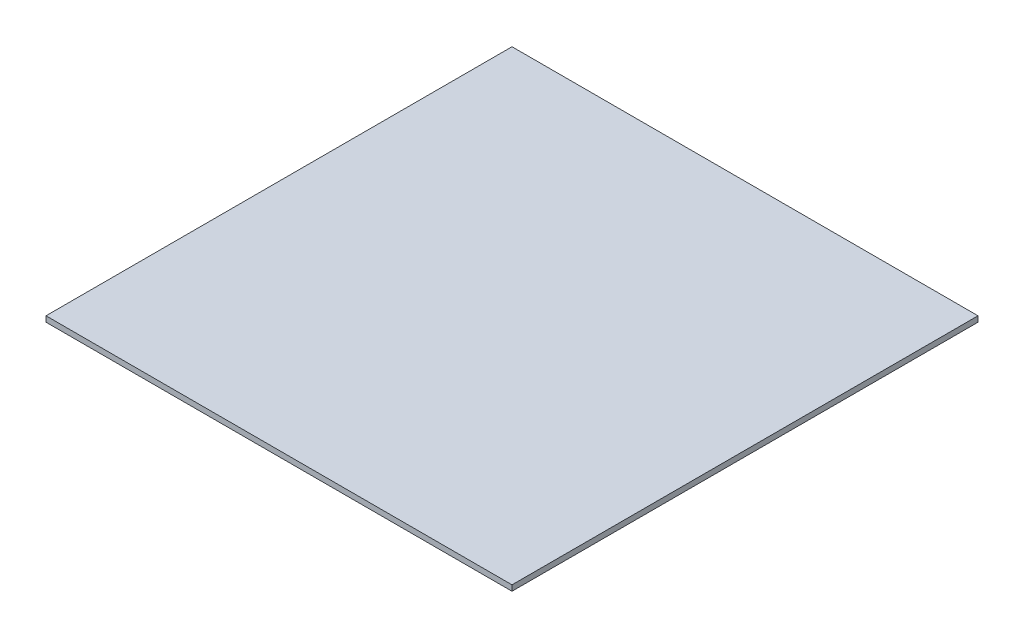
ISO-10303-21;
HEADER;
FILE_DESCRIPTION(('STEP AP214'),'2;1');
FILE_NAME('part.step','',(''),(''),'','','');
FILE_SCHEMA(('AUTOMOTIVE_DESIGN { 1 0 10303 214 1 1 1 1 }'));
ENDSEC;
DATA;
#1=APPLICATION_CONTEXT('core data for automotive mechanical design processes');
#2=APPLICATION_PROTOCOL_DEFINITION('international standard','automotive_design',2000,#1);
#3=PRODUCT_CONTEXT('',#1,'mechanical');
#4=PRODUCT('Part','Part','',(#3));
#5=PRODUCT_RELATED_PRODUCT_CATEGORY('part','',(#4));
#6=PRODUCT_DEFINITION_FORMATION('','',#4);
#7=PRODUCT_DEFINITION_CONTEXT('part definition',#1,'design');
#8=PRODUCT_DEFINITION('design','',#6,#7);
#9=PRODUCT_DEFINITION_SHAPE('','',#8);
#10=(LENGTH_UNIT() NAMED_UNIT(*) SI_UNIT(.MILLI.,.METRE.));
#11=(NAMED_UNIT(*) PLANE_ANGLE_UNIT() SI_UNIT($,.RADIAN.));
#12=(NAMED_UNIT(*) SI_UNIT($,.STERADIAN.) SOLID_ANGLE_UNIT());
#13=UNCERTAINTY_MEASURE_WITH_UNIT(LENGTH_MEASURE(1.E-05),#10,'distance_accuracy_value','');
#14=(GEOMETRIC_REPRESENTATION_CONTEXT(3) GLOBAL_UNCERTAINTY_ASSIGNED_CONTEXT((#13)) GLOBAL_UNIT_ASSIGNED_CONTEXT((#10,
#11,#12)) REPRESENTATION_CONTEXT('',''));
#15=CARTESIAN_POINT('',(0.,0.,0.));
#16=DIRECTION('',(0.,0.,1.));
#17=DIRECTION('',(1.,0.,0.));
#18=AXIS2_PLACEMENT_3D('',#15,#16,#17);
#19=CARTESIAN_POINT('',(-125.,3.,-125.));
#20=DIRECTION('',(1.,0.,0.));
#21=DIRECTION('',(0.,0.,-1.));
#22=AXIS2_PLACEMENT_3D('',#19,#20,#21);
#23=PLANE('',#22);
#24=DIRECTION('',(0.,0.,1.));
#25=VECTOR('',#24,1.);
#26=CARTESIAN_POINT('',(-125.,0.,-125.));
#27=LINE('',#26,#25);
#28=CARTESIAN_POINT('',(-125.,0.,-125.));
#29=VERTEX_POINT('',#28);
#30=CARTESIAN_POINT('',(-125.,0.,125.));
#31=VERTEX_POINT('',#30);
#32=EDGE_CURVE('E96',#29,#31,#27,.T.);
#33=ORIENTED_EDGE('',*,*,#32,.T.);
#34=DIRECTION('',(0.,-1.,0.));
#35=VECTOR('',#34,1.);
#36=CARTESIAN_POINT('',(-125.,3.,125.));
#37=LINE('',#36,#35);
#38=CARTESIAN_POINT('',(-125.,3.,125.));
#39=VERTEX_POINT('',#38);
#40=EDGE_CURVE('E11',#39,#31,#37,.T.);
#41=ORIENTED_EDGE('',*,*,#40,.F.);
#42=DIRECTION('',(0.,0.,1.));
#43=VECTOR('',#42,1.);
#44=CARTESIAN_POINT('',(-125.,3.,-125.));
#45=LINE('',#44,#43);
#46=CARTESIAN_POINT('',(-125.,3.,-125.));
#47=VERTEX_POINT('',#46);
#48=EDGE_CURVE('E84',#47,#39,#45,.T.);
#49=ORIENTED_EDGE('',*,*,#48,.F.);
#50=DIRECTION('',(0.,-1.,0.));
#51=VECTOR('',#50,1.);
#52=CARTESIAN_POINT('',(-125.,3.,-125.));
#53=LINE('',#52,#51);
#54=EDGE_CURVE('E92',#47,#29,#53,.T.);
#55=ORIENTED_EDGE('',*,*,#54,.T.);
#56=EDGE_LOOP('',(#33,#41,#49,#55));
#57=FACE_BOUND('',#56,.T.);
#58=ADVANCED_FACE('F33',(#57),#23,.F.);
#59=CARTESIAN_POINT('',(-125.,3.,125.));
#60=DIRECTION('',(0.,0.,-1.));
#61=DIRECTION('',(-1.,0.,0.));
#62=AXIS2_PLACEMENT_3D('',#59,#60,#61);
#63=PLANE('',#62);
#64=DIRECTION('',(1.,0.,0.));
#65=VECTOR('',#64,1.);
#66=CARTESIAN_POINT('',(-125.,0.,125.));
#67=LINE('',#66,#65);
#68=CARTESIAN_POINT('',(125.,0.,125.));
#69=VERTEX_POINT('',#68);
#70=EDGE_CURVE('E88',#31,#69,#67,.T.);
#71=ORIENTED_EDGE('',*,*,#70,.T.);
#72=DIRECTION('',(0.,-1.,0.));
#73=VECTOR('',#72,1.);
#74=CARTESIAN_POINT('',(125.,3.,125.));
#75=LINE('',#74,#73);
#76=CARTESIAN_POINT('',(125.,3.,125.));
#77=VERTEX_POINT('',#76);
#78=EDGE_CURVE('E41',#77,#69,#75,.T.);
#79=ORIENTED_EDGE('',*,*,#78,.F.);
#80=DIRECTION('',(1.,0.,0.));
#81=VECTOR('',#80,1.);
#82=CARTESIAN_POINT('',(-125.,3.,125.));
#83=LINE('',#82,#81);
#84=EDGE_CURVE('E79',#39,#77,#83,.T.);
#85=ORIENTED_EDGE('',*,*,#84,.F.);
#86=ORIENTED_EDGE('',*,*,#40,.T.);
#87=EDGE_LOOP('',(#71,#79,#85,#86));
#88=FACE_BOUND('',#87,.T.);
#89=ADVANCED_FACE('F87',(#88),#63,.F.);
#90=CARTESIAN_POINT('',(125.,3.,-125.));
#91=DIRECTION('',(-1.,0.,0.));
#92=DIRECTION('',(0.,0.,1.));
#93=AXIS2_PLACEMENT_3D('',#90,#91,#92);
#94=PLANE('',#93);
#95=DIRECTION('',(0.,0.,-1.));
#96=VECTOR('',#95,1.);
#97=CARTESIAN_POINT('',(125.,0.,-125.));
#98=LINE('',#97,#96);
#99=CARTESIAN_POINT('',(125.,0.,-125.));
#100=VERTEX_POINT('',#99);
#101=EDGE_CURVE('E66',#69,#100,#98,.T.);
#102=ORIENTED_EDGE('',*,*,#101,.T.);
#103=DIRECTION('',(0.,-1.,0.));
#104=VECTOR('',#103,1.);
#105=CARTESIAN_POINT('',(125.,3.,-125.));
#106=LINE('',#105,#104);
#107=CARTESIAN_POINT('',(125.,3.,-125.));
#108=VERTEX_POINT('',#107);
#109=EDGE_CURVE('E89',#108,#100,#106,.T.);
#110=ORIENTED_EDGE('',*,*,#109,.F.);
#111=DIRECTION('',(0.,0.,-1.));
#112=VECTOR('',#111,1.);
#113=CARTESIAN_POINT('',(125.,3.,-125.));
#114=LINE('',#113,#112);
#115=EDGE_CURVE('E82',#77,#108,#114,.T.);
#116=ORIENTED_EDGE('',*,*,#115,.F.);
#117=ORIENTED_EDGE('',*,*,#78,.T.);
#118=EDGE_LOOP('',(#102,#110,#116,#117));
#119=FACE_BOUND('',#118,.T.);
#120=ADVANCED_FACE('F90',(#119),#94,.F.);
#121=CARTESIAN_POINT('',(-125.,3.,-125.));
#122=DIRECTION('',(0.,0.,1.));
#123=DIRECTION('',(1.,0.,0.));
#124=AXIS2_PLACEMENT_3D('',#121,#122,#123);
#125=PLANE('',#124);
#126=DIRECTION('',(-1.,0.,0.));
#127=VECTOR('',#126,1.);
#128=CARTESIAN_POINT('',(-125.,0.,-125.));
#129=LINE('',#128,#127);
#130=EDGE_CURVE('E72',#100,#29,#129,.T.);
#131=ORIENTED_EDGE('',*,*,#130,.T.);
#132=ORIENTED_EDGE('',*,*,#54,.F.);
#133=DIRECTION('',(-1.,0.,0.));
#134=VECTOR('',#133,1.);
#135=CARTESIAN_POINT('',(-125.,3.,-125.));
#136=LINE('',#135,#134);
#137=EDGE_CURVE('E49',#108,#47,#136,.T.);
#138=ORIENTED_EDGE('',*,*,#137,.F.);
#139=ORIENTED_EDGE('',*,*,#109,.T.);
#140=EDGE_LOOP('',(#131,#132,#138,#139));
#141=FACE_BOUND('',#140,.T.);
#142=ADVANCED_FACE('F103',(#141),#125,.F.);
#143=CARTESIAN_POINT('',(0.,3.,0.));
#144=DIRECTION('',(0.,1.,0.));
#145=DIRECTION('',(0.,0.,1.));
#146=AXIS2_PLACEMENT_3D('',#143,#144,#145);
#147=PLANE('',#146);
#148=ORIENTED_EDGE('',*,*,#48,.T.);
#149=ORIENTED_EDGE('',*,*,#84,.T.);
#150=ORIENTED_EDGE('',*,*,#115,.T.);
#151=ORIENTED_EDGE('',*,*,#137,.T.);
#152=EDGE_LOOP('',(#148,#149,#150,#151));
#153=FACE_BOUND('',#152,.T.);
#154=ADVANCED_FACE('F80',(#153),#147,.T.);
#155=CARTESIAN_POINT('',(0.,0.,0.));
#156=DIRECTION('',(0.,1.,0.));
#157=DIRECTION('',(0.,0.,1.));
#158=AXIS2_PLACEMENT_3D('',#155,#156,#157);
#159=PLANE('',#158);
#160=ORIENTED_EDGE('',*,*,#32,.F.);
#161=ORIENTED_EDGE('',*,*,#130,.F.);
#162=ORIENTED_EDGE('',*,*,#101,.F.);
#163=ORIENTED_EDGE('',*,*,#70,.F.);
#164=EDGE_LOOP('',(#160,#161,#162,#163));
#165=FACE_BOUND('',#164,.T.);
#166=ADVANCED_FACE('F106',(#165),#159,.F.);
#167=CLOSED_SHELL('',(#58,#89,#120,#142,#154,#166));
#168=MANIFOLD_SOLID_BREP('B2',#167);
#169=ADVANCED_BREP_SHAPE_REPRESENTATION('',(#18,#168),#14);
#170=SHAPE_DEFINITION_REPRESENTATION(#9,#169);
ENDSEC;
END-ISO-10303-21;
